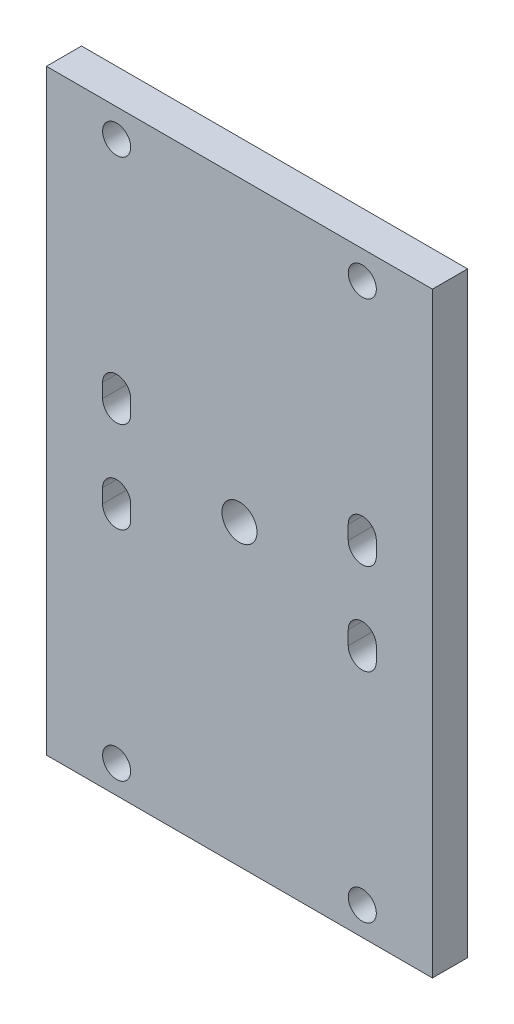
ISO-10303-21;
HEADER;
FILE_DESCRIPTION(('STEP AP214'),'2;1');
FILE_NAME('part.step','',(''),(''),'','','');
FILE_SCHEMA(('AUTOMOTIVE_DESIGN { 1 0 10303 214 1 1 1 1 }'));
ENDSEC;
DATA;
#1=APPLICATION_CONTEXT('core data for automotive mechanical design processes');
#2=APPLICATION_PROTOCOL_DEFINITION('international standard','automotive_design',2000,#1);
#3=PRODUCT_CONTEXT('',#1,'mechanical');
#4=PRODUCT('Part','Part','',(#3));
#5=PRODUCT_RELATED_PRODUCT_CATEGORY('part','',(#4));
#6=PRODUCT_DEFINITION_FORMATION('','',#4);
#7=PRODUCT_DEFINITION_CONTEXT('part definition',#1,'design');
#8=PRODUCT_DEFINITION('design','',#6,#7);
#9=PRODUCT_DEFINITION_SHAPE('','',#8);
#10=(LENGTH_UNIT() NAMED_UNIT(*) SI_UNIT(.MILLI.,.METRE.));
#11=(NAMED_UNIT(*) PLANE_ANGLE_UNIT() SI_UNIT($,.RADIAN.));
#12=(NAMED_UNIT(*) SI_UNIT($,.STERADIAN.) SOLID_ANGLE_UNIT());
#13=UNCERTAINTY_MEASURE_WITH_UNIT(LENGTH_MEASURE(1.E-05),#10,'distance_accuracy_value','');
#14=(GEOMETRIC_REPRESENTATION_CONTEXT(3) GLOBAL_UNCERTAINTY_ASSIGNED_CONTEXT((#13)) GLOBAL_UNIT_ASSIGNED_CONTEXT((#10,
#11,#12)) REPRESENTATION_CONTEXT('',''));
#15=CARTESIAN_POINT('',(0.,0.,0.));
#16=DIRECTION('',(0.,0.,1.));
#17=DIRECTION('',(1.,0.,0.));
#18=AXIS2_PLACEMENT_3D('',#15,#16,#17);
#19=CARTESIAN_POINT('',(17.5,-7.5,-5.));
#20=DIRECTION('',(0.,0.,1.));
#21=DIRECTION('',(1.,0.,0.));
#22=AXIS2_PLACEMENT_3D('',#19,#20,#21);
#23=CYLINDRICAL_SURFACE('',#22,2.);
#24=DIRECTION('',(0.,0.,1.));
#25=VECTOR('',#24,1.);
#26=CARTESIAN_POINT('',(15.5,-7.5,-5.));
#27=LINE('',#26,#25);
#28=CARTESIAN_POINT('',(15.5,-7.5,5.));
#29=VERTEX_POINT('',#28);
#30=CARTESIAN_POINT('',(15.5,-7.5,0.));
#31=VERTEX_POINT('',#30);
#32=EDGE_CURVE('E356',#29,#31,#27,.F.);
#33=ORIENTED_EDGE('',*,*,#32,.F.);
#34=CARTESIAN_POINT('',(17.5,-7.5,5.));
#35=DIRECTION('',(0.,0.,1.));
#36=DIRECTION('',(1.,0.,0.));
#37=AXIS2_PLACEMENT_3D('',#34,#35,#36);
#38=CIRCLE('',#37,2.);
#39=CARTESIAN_POINT('',(19.5,-7.5,5.));
#40=VERTEX_POINT('',#39);
#41=EDGE_CURVE('E270',#29,#40,#38,.T.);
#42=ORIENTED_EDGE('',*,*,#41,.T.);
#43=DIRECTION('',(0.,0.,1.));
#44=VECTOR('',#43,1.);
#45=CARTESIAN_POINT('',(19.5,-7.5,-5.));
#46=LINE('',#45,#44);
#47=CARTESIAN_POINT('',(19.5,-7.5,0.));
#48=VERTEX_POINT('',#47);
#49=EDGE_CURVE('E354',#40,#48,#46,.F.);
#50=ORIENTED_EDGE('',*,*,#49,.T.);
#51=CARTESIAN_POINT('',(17.5,-7.5,0.));
#52=DIRECTION('',(0.,0.,-1.));
#53=DIRECTION('',(-1.,0.,0.));
#54=AXIS2_PLACEMENT_3D('',#51,#52,#53);
#55=CIRCLE('',#54,2.);
#56=EDGE_CURVE('E334',#48,#31,#55,.T.);
#57=ORIENTED_EDGE('',*,*,#56,.T.);
#58=EDGE_LOOP('',(#33,#42,#50,#57));
#59=FACE_BOUND('',#58,.T.);
#60=ADVANCED_FACE('F34',(#59),#23,.F.);
#61=CARTESIAN_POINT('',(-17.5,7.5,-5.));
#62=DIRECTION('',(0.,0.,1.));
#63=DIRECTION('',(1.,0.,0.));
#64=AXIS2_PLACEMENT_3D('',#61,#62,#63);
#65=CYLINDRICAL_SURFACE('',#64,2.);
#66=DIRECTION('',(0.,0.,1.));
#67=VECTOR('',#66,1.);
#68=CARTESIAN_POINT('',(-15.5,7.5,-5.));
#69=LINE('',#68,#67);
#70=CARTESIAN_POINT('',(-15.5,7.5,5.));
#71=VERTEX_POINT('',#70);
#72=CARTESIAN_POINT('',(-15.5,7.5,0.));
#73=VERTEX_POINT('',#72);
#74=EDGE_CURVE('E352',#71,#73,#69,.F.);
#75=ORIENTED_EDGE('',*,*,#74,.F.);
#76=CARTESIAN_POINT('',(-17.5,7.5,5.));
#77=DIRECTION('',(0.,0.,1.));
#78=DIRECTION('',(1.,0.,0.));
#79=AXIS2_PLACEMENT_3D('',#76,#77,#78);
#80=CIRCLE('',#79,2.);
#81=CARTESIAN_POINT('',(-19.5,7.5,5.));
#82=VERTEX_POINT('',#81);
#83=EDGE_CURVE('E285',#71,#82,#80,.T.);
#84=ORIENTED_EDGE('',*,*,#83,.T.);
#85=DIRECTION('',(0.,0.,1.));
#86=VECTOR('',#85,1.);
#87=CARTESIAN_POINT('',(-19.5,7.5,-5.));
#88=LINE('',#87,#86);
#89=CARTESIAN_POINT('',(-19.5,7.5,0.));
#90=VERTEX_POINT('',#89);
#91=EDGE_CURVE('E350',#82,#90,#88,.F.);
#92=ORIENTED_EDGE('',*,*,#91,.T.);
#93=CARTESIAN_POINT('',(-17.5,7.5,0.));
#94=DIRECTION('',(0.,0.,-1.));
#95=DIRECTION('',(-1.,0.,0.));
#96=AXIS2_PLACEMENT_3D('',#93,#94,#95);
#97=CIRCLE('',#96,2.);
#98=EDGE_CURVE('E198',#90,#73,#97,.T.);
#99=ORIENTED_EDGE('',*,*,#98,.T.);
#100=EDGE_LOOP('',(#75,#84,#92,#99));
#101=FACE_BOUND('',#100,.T.);
#102=ADVANCED_FACE('F387',(#101),#65,.F.);
#103=CARTESIAN_POINT('',(27.5,-42.5,5.));
#104=DIRECTION('',(-1.,0.,0.));
#105=DIRECTION('',(0.,0.,1.));
#106=AXIS2_PLACEMENT_3D('',#103,#104,#105);
#107=PLANE('',#106);
#108=DIRECTION('',(0.,1.,0.));
#109=VECTOR('',#108,1.);
#110=CARTESIAN_POINT('',(27.5,-42.5,0.));
#111=LINE('',#110,#109);
#112=CARTESIAN_POINT('',(27.5,-42.5,0.));
#113=VERTEX_POINT('',#112);
#114=CARTESIAN_POINT('',(27.5,42.5,0.));
#115=VERTEX_POINT('',#114);
#116=EDGE_CURVE('E305',#113,#115,#111,.T.);
#117=ORIENTED_EDGE('',*,*,#116,.T.);
#118=DIRECTION('',(0.,0.,-1.));
#119=VECTOR('',#118,1.);
#120=CARTESIAN_POINT('',(27.5,42.5,5.));
#121=LINE('',#120,#119);
#122=CARTESIAN_POINT('',(27.5,42.5,5.));
#123=VERTEX_POINT('',#122);
#124=EDGE_CURVE('E322',#123,#115,#121,.T.);
#125=ORIENTED_EDGE('',*,*,#124,.F.);
#126=DIRECTION('',(0.,1.,0.));
#127=VECTOR('',#126,1.);
#128=CARTESIAN_POINT('',(27.5,-42.5,5.));
#129=LINE('',#128,#127);
#130=CARTESIAN_POINT('',(27.5,-42.5,5.));
#131=VERTEX_POINT('',#130);
#132=EDGE_CURVE('E294',#131,#123,#129,.T.);
#133=ORIENTED_EDGE('',*,*,#132,.F.);
#134=DIRECTION('',(0.,0.,-1.));
#135=VECTOR('',#134,1.);
#136=CARTESIAN_POINT('',(27.5,-42.5,5.));
#137=LINE('',#136,#135);
#138=EDGE_CURVE('E304',#131,#113,#137,.T.);
#139=ORIENTED_EDGE('',*,*,#138,.T.);
#140=EDGE_LOOP('',(#117,#125,#133,#139));
#141=FACE_BOUND('',#140,.T.);
#142=ADVANCED_FACE('F36',(#141),#107,.F.);
#143=CARTESIAN_POINT('',(-27.5,42.5,5.));
#144=DIRECTION('',(0.,-1.,0.));
#145=DIRECTION('',(0.,0.,-1.));
#146=AXIS2_PLACEMENT_3D('',#143,#144,#145);
#147=PLANE('',#146);
#148=DIRECTION('',(-1.,0.,0.));
#149=VECTOR('',#148,1.);
#150=CARTESIAN_POINT('',(-27.5,42.5,0.));
#151=LINE('',#150,#149);
#152=CARTESIAN_POINT('',(-27.5,42.5,0.));
#153=VERTEX_POINT('',#152);
#154=EDGE_CURVE('E308',#115,#153,#151,.T.);
#155=ORIENTED_EDGE('',*,*,#154,.T.);
#156=DIRECTION('',(0.,0.,-1.));
#157=VECTOR('',#156,1.);
#158=CARTESIAN_POINT('',(-27.5,42.5,5.));
#159=LINE('',#158,#157);
#160=CARTESIAN_POINT('',(-27.5,42.5,5.));
#161=VERTEX_POINT('',#160);
#162=EDGE_CURVE('E319',#161,#153,#159,.T.);
#163=ORIENTED_EDGE('',*,*,#162,.F.);
#164=DIRECTION('',(-1.,0.,0.));
#165=VECTOR('',#164,1.);
#166=CARTESIAN_POINT('',(-27.5,42.5,5.));
#167=LINE('',#166,#165);
#168=EDGE_CURVE('E297',#123,#161,#167,.T.);
#169=ORIENTED_EDGE('',*,*,#168,.F.);
#170=ORIENTED_EDGE('',*,*,#124,.T.);
#171=EDGE_LOOP('',(#155,#163,#169,#170));
#172=FACE_BOUND('',#171,.T.);
#173=ADVANCED_FACE('F436',(#172),#147,.F.);
#174=CARTESIAN_POINT('',(-27.5,-42.5,5.));
#175=DIRECTION('',(1.,0.,0.));
#176=DIRECTION('',(0.,0.,-1.));
#177=AXIS2_PLACEMENT_3D('',#174,#175,#176);
#178=PLANE('',#177);
#179=DIRECTION('',(0.,-1.,0.));
#180=VECTOR('',#179,1.);
#181=CARTESIAN_POINT('',(-27.5,-42.5,0.));
#182=LINE('',#181,#180);
#183=CARTESIAN_POINT('',(-27.5,-42.5,0.));
#184=VERTEX_POINT('',#183);
#185=EDGE_CURVE('E311',#153,#184,#182,.T.);
#186=ORIENTED_EDGE('',*,*,#185,.T.);
#187=DIRECTION('',(0.,0.,-1.));
#188=VECTOR('',#187,1.);
#189=CARTESIAN_POINT('',(-27.5,-42.5,5.));
#190=LINE('',#189,#188);
#191=CARTESIAN_POINT('',(-27.5,-42.5,5.));
#192=VERTEX_POINT('',#191);
#193=EDGE_CURVE('E316',#192,#184,#190,.T.);
#194=ORIENTED_EDGE('',*,*,#193,.F.);
#195=DIRECTION('',(0.,-1.,0.));
#196=VECTOR('',#195,1.);
#197=CARTESIAN_POINT('',(-27.5,-42.5,5.));
#198=LINE('',#197,#196);
#199=EDGE_CURVE('E300',#161,#192,#198,.T.);
#200=ORIENTED_EDGE('',*,*,#199,.F.);
#201=ORIENTED_EDGE('',*,*,#162,.T.);
#202=EDGE_LOOP('',(#186,#194,#200,#201));
#203=FACE_BOUND('',#202,.T.);
#204=ADVANCED_FACE('F433',(#203),#178,.F.);
#205=CARTESIAN_POINT('',(-27.5,-42.5,5.));
#206=DIRECTION('',(0.,1.,0.));
#207=DIRECTION('',(0.,0.,1.));
#208=AXIS2_PLACEMENT_3D('',#205,#206,#207);
#209=PLANE('',#208);
#210=DIRECTION('',(1.,0.,0.));
#211=VECTOR('',#210,1.);
#212=CARTESIAN_POINT('',(-27.5,-42.5,0.));
#213=LINE('',#212,#211);
#214=EDGE_CURVE('E298',#184,#113,#213,.T.);
#215=ORIENTED_EDGE('',*,*,#214,.T.);
#216=ORIENTED_EDGE('',*,*,#138,.F.);
#217=DIRECTION('',(1.,0.,0.));
#218=VECTOR('',#217,1.);
#219=CARTESIAN_POINT('',(-27.5,-42.5,5.));
#220=LINE('',#219,#218);
#221=EDGE_CURVE('E302',#192,#131,#220,.T.);
#222=ORIENTED_EDGE('',*,*,#221,.F.);
#223=ORIENTED_EDGE('',*,*,#193,.T.);
#224=EDGE_LOOP('',(#215,#216,#222,#223));
#225=FACE_BOUND('',#224,.T.);
#226=ADVANCED_FACE('F426',(#225),#209,.F.);
#227=CARTESIAN_POINT('',(0.,0.,5.));
#228=DIRECTION('',(0.,0.,-1.));
#229=DIRECTION('',(-1.,0.,0.));
#230=AXIS2_PLACEMENT_3D('',#227,#228,#229);
#231=PLANE('',#230);
#232=CARTESIAN_POINT('',(0.,0.,5.));
#233=DIRECTION('',(0.,0.,1.));
#234=DIRECTION('',(1.,0.,0.));
#235=AXIS2_PLACEMENT_3D('',#232,#233,#234);
#236=CIRCLE('',#235,2.5);
#237=CARTESIAN_POINT('',(2.5,0.,5.));
#238=VERTEX_POINT('',#237);
#239=EDGE_CURVE('E615',#238,#238,#236,.T.);
#240=ORIENTED_EDGE('',*,*,#239,.F.);
#241=EDGE_LOOP('',(#240));
#242=FACE_BOUND('',#241,.T.);
#243=CARTESIAN_POINT('',(17.5,-38.5,5.));
#244=DIRECTION('',(0.,0.,1.));
#245=DIRECTION('',(1.,0.,0.));
#246=AXIS2_PLACEMENT_3D('',#243,#244,#245);
#247=CIRCLE('',#246,2.);
#248=CARTESIAN_POINT('',(19.5,-38.5,5.));
#249=VERTEX_POINT('',#248);
#250=EDGE_CURVE('E273',#249,#249,#247,.T.);
#251=ORIENTED_EDGE('',*,*,#250,.F.);
#252=EDGE_LOOP('',(#251));
#253=FACE_BOUND('',#252,.T.);
#254=CARTESIAN_POINT('',(17.5,38.5,5.));
#255=DIRECTION('',(0.,0.,1.));
#256=DIRECTION('',(-1.,0.,0.));
#257=AXIS2_PLACEMENT_3D('',#254,#255,#256);
#258=CIRCLE('',#257,2.);
#259=CARTESIAN_POINT('',(15.5,38.5,5.));
#260=VERTEX_POINT('',#259);
#261=EDGE_CURVE('E279',#260,#260,#258,.T.);
#262=ORIENTED_EDGE('',*,*,#261,.F.);
#263=EDGE_LOOP('',(#262));
#264=FACE_BOUND('',#263,.T.);
#265=CARTESIAN_POINT('',(17.5,5.5,5.));
#266=DIRECTION('',(0.,0.,-1.));
#267=DIRECTION('',(-1.,0.,0.));
#268=AXIS2_PLACEMENT_3D('',#265,#266,#267);
#269=CIRCLE('',#268,2.);
#270=CARTESIAN_POINT('',(19.5,5.5,5.));
#271=VERTEX_POINT('',#270);
#272=CARTESIAN_POINT('',(15.5,5.5,5.));
#273=VERTEX_POINT('',#272);
#274=EDGE_CURVE('E258',#271,#273,#269,.T.);
#275=ORIENTED_EDGE('',*,*,#274,.T.);
#276=DIRECTION('',(0.,1.,0.));
#277=VECTOR('',#276,1.);
#278=CARTESIAN_POINT('',(15.5,0.,5.));
#279=LINE('',#278,#277);
#280=CARTESIAN_POINT('',(15.5,7.5,5.));
#281=VERTEX_POINT('',#280);
#282=EDGE_CURVE('E241',#273,#281,#279,.T.);
#283=ORIENTED_EDGE('',*,*,#282,.T.);
#284=CARTESIAN_POINT('',(17.5,7.5,5.));
#285=DIRECTION('',(0.,0.,1.));
#286=DIRECTION('',(-1.,0.,0.));
#287=AXIS2_PLACEMENT_3D('',#284,#285,#286);
#288=CIRCLE('',#287,2.);
#289=CARTESIAN_POINT('',(19.5,7.5,5.));
#290=VERTEX_POINT('',#289);
#291=EDGE_CURVE('E282',#290,#281,#288,.T.);
#292=ORIENTED_EDGE('',*,*,#291,.F.);
#293=DIRECTION('',(0.,-1.,0.));
#294=VECTOR('',#293,1.);
#295=CARTESIAN_POINT('',(19.5,0.,5.));
#296=LINE('',#295,#294);
#297=EDGE_CURVE('E237',#290,#271,#296,.T.);
#298=ORIENTED_EDGE('',*,*,#297,.T.);
#299=EDGE_LOOP('',(#275,#283,#292,#298));
#300=FACE_BOUND('',#299,.T.);
#301=ORIENTED_EDGE('',*,*,#83,.F.);
#302=DIRECTION('',(0.,-1.,0.));
#303=VECTOR('',#302,1.);
#304=CARTESIAN_POINT('',(-15.5,0.,5.));
#305=LINE('',#304,#303);
#306=CARTESIAN_POINT('',(-15.5,5.5,5.));
#307=VERTEX_POINT('',#306);
#308=EDGE_CURVE('E245',#71,#307,#305,.T.);
#309=ORIENTED_EDGE('',*,*,#308,.T.);
#310=CARTESIAN_POINT('',(-17.5,5.5,5.));
#311=DIRECTION('',(0.,0.,-1.));
#312=DIRECTION('',(-1.,0.,0.));
#313=AXIS2_PLACEMENT_3D('',#310,#311,#312);
#314=CIRCLE('',#313,2.);
#315=CARTESIAN_POINT('',(-19.5,5.5,5.));
#316=VERTEX_POINT('',#315);
#317=EDGE_CURVE('E261',#307,#316,#314,.T.);
#318=ORIENTED_EDGE('',*,*,#317,.T.);
#319=DIRECTION('',(0.,1.,0.));
#320=VECTOR('',#319,1.);
#321=CARTESIAN_POINT('',(-19.5,0.,5.));
#322=LINE('',#321,#320);
#323=EDGE_CURVE('E179',#316,#82,#322,.T.);
#324=ORIENTED_EDGE('',*,*,#323,.T.);
#325=EDGE_LOOP('',(#301,#309,#318,#324));
#326=FACE_BOUND('',#325,.T.);
#327=ORIENTED_EDGE('',*,*,#41,.F.);
#328=DIRECTION('',(0.,1.,0.));
#329=VECTOR('',#328,1.);
#330=CARTESIAN_POINT('',(15.5,0.,5.));
#331=LINE('',#330,#329);
#332=CARTESIAN_POINT('',(15.5,-5.5,5.));
#333=VERTEX_POINT('',#332);
#334=EDGE_CURVE('E251',#29,#333,#331,.T.);
#335=ORIENTED_EDGE('',*,*,#334,.T.);
#336=CARTESIAN_POINT('',(17.5,-5.5,5.));
#337=DIRECTION('',(0.,0.,-1.));
#338=DIRECTION('',(-1.,0.,0.));
#339=AXIS2_PLACEMENT_3D('',#336,#337,#338);
#340=CIRCLE('',#339,2.);
#341=CARTESIAN_POINT('',(19.5,-5.5,5.));
#342=VERTEX_POINT('',#341);
#343=EDGE_CURVE('E266',#333,#342,#340,.T.);
#344=ORIENTED_EDGE('',*,*,#343,.T.);
#345=DIRECTION('',(0.,-1.,0.));
#346=VECTOR('',#345,1.);
#347=CARTESIAN_POINT('',(19.5,0.,5.));
#348=LINE('',#347,#346);
#349=EDGE_CURVE('E248',#342,#40,#348,.T.);
#350=ORIENTED_EDGE('',*,*,#349,.T.);
#351=EDGE_LOOP('',(#327,#335,#344,#350));
#352=FACE_BOUND('',#351,.T.);
#353=CARTESIAN_POINT('',(-17.5,-5.5,5.));
#354=DIRECTION('',(0.,0.,-1.));
#355=DIRECTION('',(-1.,0.,0.));
#356=AXIS2_PLACEMENT_3D('',#353,#354,#355);
#357=CIRCLE('',#356,2.);
#358=CARTESIAN_POINT('',(-19.5,-5.5,5.));
#359=VERTEX_POINT('',#358);
#360=CARTESIAN_POINT('',(-15.5,-5.5,5.));
#361=VERTEX_POINT('',#360);
#362=EDGE_CURVE('E263',#359,#361,#357,.T.);
#363=ORIENTED_EDGE('',*,*,#362,.T.);
#364=DIRECTION('',(0.,-1.,0.));
#365=VECTOR('',#364,1.);
#366=CARTESIAN_POINT('',(-15.5,0.,5.));
#367=LINE('',#366,#365);
#368=CARTESIAN_POINT('',(-15.5,-7.5,5.));
#369=VERTEX_POINT('',#368);
#370=EDGE_CURVE('E255',#361,#369,#367,.T.);
#371=ORIENTED_EDGE('',*,*,#370,.T.);
#372=CARTESIAN_POINT('',(-17.5,-7.5,5.));
#373=DIRECTION('',(0.,0.,1.));
#374=DIRECTION('',(-1.,0.,0.));
#375=AXIS2_PLACEMENT_3D('',#372,#373,#374);
#376=CIRCLE('',#375,2.);
#377=CARTESIAN_POINT('',(-19.5,-7.5,5.));
#378=VERTEX_POINT('',#377);
#379=EDGE_CURVE('E274',#378,#369,#376,.T.);
#380=ORIENTED_EDGE('',*,*,#379,.F.);
#381=DIRECTION('',(0.,1.,0.));
#382=VECTOR('',#381,1.);
#383=CARTESIAN_POINT('',(-19.5,0.,5.));
#384=LINE('',#383,#382);
#385=EDGE_CURVE('E50',#378,#359,#384,.T.);
#386=ORIENTED_EDGE('',*,*,#385,.T.);
#387=EDGE_LOOP('',(#363,#371,#380,#386));
#388=FACE_BOUND('',#387,.T.);
#389=CARTESIAN_POINT('',(-17.5,-38.5,5.));
#390=DIRECTION('',(0.,0.,1.));
#391=DIRECTION('',(-1.,0.,0.));
#392=AXIS2_PLACEMENT_3D('',#389,#390,#391);
#393=CIRCLE('',#392,2.);
#394=CARTESIAN_POINT('',(-19.5,-38.5,5.));
#395=VERTEX_POINT('',#394);
#396=EDGE_CURVE('E269',#395,#395,#393,.T.);
#397=ORIENTED_EDGE('',*,*,#396,.F.);
#398=EDGE_LOOP('',(#397));
#399=FACE_BOUND('',#398,.T.);
#400=CARTESIAN_POINT('',(-17.5,38.5,5.));
#401=DIRECTION('',(0.,0.,1.));
#402=DIRECTION('',(1.,0.,0.));
#403=AXIS2_PLACEMENT_3D('',#400,#401,#402);
#404=CIRCLE('',#403,2.);
#405=CARTESIAN_POINT('',(-15.5,38.5,5.));
#406=VERTEX_POINT('',#405);
#407=EDGE_CURVE('E288',#406,#406,#404,.T.);
#408=ORIENTED_EDGE('',*,*,#407,.F.);
#409=EDGE_LOOP('',(#408));
#410=FACE_BOUND('',#409,.T.);
#411=ORIENTED_EDGE('',*,*,#132,.T.);
#412=ORIENTED_EDGE('',*,*,#168,.T.);
#413=ORIENTED_EDGE('',*,*,#199,.T.);
#414=ORIENTED_EDGE('',*,*,#221,.T.);
#415=EDGE_LOOP('',(#411,#412,#413,#414));
#416=FACE_BOUND('',#415,.T.);
#417=ADVANCED_FACE('F371',(#242,#253,#264,#300,#326,#352,#388,#399,#410,#416),#231,.F.);
#418=CARTESIAN_POINT('',(0.,0.,0.));
#419=DIRECTION('',(0.,0.,-1.));
#420=DIRECTION('',(-1.,0.,0.));
#421=AXIS2_PLACEMENT_3D('',#418,#419,#420);
#422=PLANE('',#421);
#423=CARTESIAN_POINT('',(0.,0.,0.));
#424=DIRECTION('',(0.,0.,-1.));
#425=DIRECTION('',(-1.,0.,0.));
#426=AXIS2_PLACEMENT_3D('',#423,#424,#425);
#427=CIRCLE('',#426,2.5);
#428=CARTESIAN_POINT('',(-2.5,0.,0.));
#429=VERTEX_POINT('',#428);
#430=EDGE_CURVE('E38',#429,#429,#427,.T.);
#431=ORIENTED_EDGE('',*,*,#430,.F.);
#432=EDGE_LOOP('',(#431));
#433=FACE_BOUND('',#432,.T.);
#434=DIRECTION('',(0.,1.,0.));
#435=VECTOR('',#434,1.);
#436=CARTESIAN_POINT('',(15.5,-7.5,0.));
#437=LINE('',#436,#435);
#438=CARTESIAN_POINT('',(15.5,-5.5,0.));
#439=VERTEX_POINT('',#438);
#440=EDGE_CURVE('E221',#31,#439,#437,.T.);
#441=ORIENTED_EDGE('',*,*,#440,.F.);
#442=ORIENTED_EDGE('',*,*,#56,.F.);
#443=DIRECTION('',(0.,-1.,0.));
#444=VECTOR('',#443,1.);
#445=CARTESIAN_POINT('',(19.5,-7.5,0.));
#446=LINE('',#445,#444);
#447=CARTESIAN_POINT('',(19.5,-5.5,0.));
#448=VERTEX_POINT('',#447);
#449=EDGE_CURVE('E58',#448,#48,#446,.T.);
#450=ORIENTED_EDGE('',*,*,#449,.F.);
#451=CARTESIAN_POINT('',(17.5,-5.5,0.));
#452=DIRECTION('',(0.,0.,-1.));
#453=DIRECTION('',(1.,0.,0.));
#454=AXIS2_PLACEMENT_3D('',#451,#452,#453);
#455=CIRCLE('',#454,2.);
#456=EDGE_CURVE('E217',#439,#448,#455,.T.);
#457=ORIENTED_EDGE('',*,*,#456,.F.);
#458=EDGE_LOOP('',(#441,#442,#450,#457));
#459=FACE_BOUND('',#458,.T.);
#460=DIRECTION('',(0.,-1.,0.));
#461=VECTOR('',#460,1.);
#462=CARTESIAN_POINT('',(-15.5,-7.5,0.));
#463=LINE('',#462,#461);
#464=CARTESIAN_POINT('',(-15.5,-5.5,0.));
#465=VERTEX_POINT('',#464);
#466=CARTESIAN_POINT('',(-15.5,-7.5,0.));
#467=VERTEX_POINT('',#466);
#468=EDGE_CURVE('E212',#465,#467,#463,.T.);
#469=ORIENTED_EDGE('',*,*,#468,.F.);
#470=CARTESIAN_POINT('',(-17.5,-5.5,0.));
#471=DIRECTION('',(0.,0.,-1.));
#472=DIRECTION('',(-1.,0.,0.));
#473=AXIS2_PLACEMENT_3D('',#470,#471,#472);
#474=CIRCLE('',#473,2.);
#475=CARTESIAN_POINT('',(-19.5,-5.5,0.));
#476=VERTEX_POINT('',#475);
#477=EDGE_CURVE('E208',#476,#465,#474,.T.);
#478=ORIENTED_EDGE('',*,*,#477,.F.);
#479=DIRECTION('',(0.,1.,0.));
#480=VECTOR('',#479,1.);
#481=CARTESIAN_POINT('',(-19.5,-7.5,0.));
#482=LINE('',#481,#480);
#483=CARTESIAN_POINT('',(-19.5,-7.5,0.));
#484=VERTEX_POINT('',#483);
#485=EDGE_CURVE('E205',#484,#476,#482,.T.);
#486=ORIENTED_EDGE('',*,*,#485,.F.);
#487=CARTESIAN_POINT('',(-17.5,-7.5,0.));
#488=DIRECTION('',(0.,0.,-1.));
#489=DIRECTION('',(-1.,0.,0.));
#490=AXIS2_PLACEMENT_3D('',#487,#488,#489);
#491=CIRCLE('',#490,2.);
#492=EDGE_CURVE('E331',#467,#484,#491,.T.);
#493=ORIENTED_EDGE('',*,*,#492,.F.);
#494=EDGE_LOOP('',(#469,#478,#486,#493));
#495=FACE_BOUND('',#494,.T.);
#496=DIRECTION('',(0.,-1.,0.));
#497=VECTOR('',#496,1.);
#498=CARTESIAN_POINT('',(-15.5,7.5,0.));
#499=LINE('',#498,#497);
#500=CARTESIAN_POINT('',(-15.5,5.5,0.));
#501=VERTEX_POINT('',#500);
#502=EDGE_CURVE('E183',#73,#501,#499,.T.);
#503=ORIENTED_EDGE('',*,*,#502,.F.);
#504=ORIENTED_EDGE('',*,*,#98,.F.);
#505=DIRECTION('',(0.,1.,0.));
#506=VECTOR('',#505,1.);
#507=CARTESIAN_POINT('',(-19.5,7.5,0.));
#508=LINE('',#507,#506);
#509=CARTESIAN_POINT('',(-19.5,5.5,0.));
#510=VERTEX_POINT('',#509);
#511=EDGE_CURVE('E176',#510,#90,#508,.T.);
#512=ORIENTED_EDGE('',*,*,#511,.F.);
#513=CARTESIAN_POINT('',(-17.5,5.5,0.));
#514=DIRECTION('',(0.,0.,-1.));
#515=DIRECTION('',(1.,0.,0.));
#516=AXIS2_PLACEMENT_3D('',#513,#514,#515);
#517=CIRCLE('',#516,2.);
#518=EDGE_CURVE('E186',#501,#510,#517,.T.);
#519=ORIENTED_EDGE('',*,*,#518,.F.);
#520=EDGE_LOOP('',(#503,#504,#512,#519));
#521=FACE_BOUND('',#520,.T.);
#522=DIRECTION('',(0.,1.,0.));
#523=VECTOR('',#522,1.);
#524=CARTESIAN_POINT('',(15.5,7.5,0.));
#525=LINE('',#524,#523);
#526=CARTESIAN_POINT('',(15.5,5.5,0.));
#527=VERTEX_POINT('',#526);
#528=CARTESIAN_POINT('',(15.5,7.5,0.));
#529=VERTEX_POINT('',#528);
#530=EDGE_CURVE('E232',#527,#529,#525,.T.);
#531=ORIENTED_EDGE('',*,*,#530,.F.);
#532=CARTESIAN_POINT('',(17.5,5.5,0.));
#533=DIRECTION('',(0.,0.,-1.));
#534=DIRECTION('',(-1.,0.,0.));
#535=AXIS2_PLACEMENT_3D('',#532,#533,#534);
#536=CIRCLE('',#535,2.);
#537=CARTESIAN_POINT('',(19.5,5.5,0.));
#538=VERTEX_POINT('',#537);
#539=EDGE_CURVE('E229',#538,#527,#536,.T.);
#540=ORIENTED_EDGE('',*,*,#539,.F.);
#541=DIRECTION('',(0.,-1.,0.));
#542=VECTOR('',#541,1.);
#543=CARTESIAN_POINT('',(19.5,7.5,0.));
#544=LINE('',#543,#542);
#545=CARTESIAN_POINT('',(19.5,7.5,0.));
#546=VERTEX_POINT('',#545);
#547=EDGE_CURVE('E203',#546,#538,#544,.T.);
#548=ORIENTED_EDGE('',*,*,#547,.F.);
#549=CARTESIAN_POINT('',(17.5,7.5,0.));
#550=DIRECTION('',(0.,0.,-1.));
#551=DIRECTION('',(-1.,0.,0.));
#552=AXIS2_PLACEMENT_3D('',#549,#550,#551);
#553=CIRCLE('',#552,2.);
#554=EDGE_CURVE('E338',#529,#546,#553,.T.);
#555=ORIENTED_EDGE('',*,*,#554,.F.);
#556=EDGE_LOOP('',(#531,#540,#548,#555));
#557=FACE_BOUND('',#556,.T.);
#558=CARTESIAN_POINT('',(17.5,-38.5,0.));
#559=DIRECTION('',(0.,0.,-1.));
#560=DIRECTION('',(-1.,0.,0.));
#561=AXIS2_PLACEMENT_3D('',#558,#559,#560);
#562=CIRCLE('',#561,2.);
#563=CARTESIAN_POINT('',(15.5,-38.5,0.));
#564=VERTEX_POINT('',#563);
#565=EDGE_CURVE('E309',#564,#564,#562,.T.);
#566=ORIENTED_EDGE('',*,*,#565,.F.);
#567=EDGE_LOOP('',(#566));
#568=FACE_BOUND('',#567,.T.);
#569=CARTESIAN_POINT('',(17.5,38.5,0.));
#570=DIRECTION('',(0.,0.,-1.));
#571=DIRECTION('',(-1.,0.,0.));
#572=AXIS2_PLACEMENT_3D('',#569,#570,#571);
#573=CIRCLE('',#572,2.);
#574=CARTESIAN_POINT('',(15.5,38.5,0.));
#575=VERTEX_POINT('',#574);
#576=EDGE_CURVE('E341',#575,#575,#573,.T.);
#577=ORIENTED_EDGE('',*,*,#576,.F.);
#578=EDGE_LOOP('',(#577));
#579=FACE_BOUND('',#578,.T.);
#580=CARTESIAN_POINT('',(-17.5,-38.5,0.));
#581=DIRECTION('',(0.,0.,-1.));
#582=DIRECTION('',(-1.,0.,0.));
#583=AXIS2_PLACEMENT_3D('',#580,#581,#582);
#584=CIRCLE('',#583,2.);
#585=CARTESIAN_POINT('',(-19.5,-38.5,0.));
#586=VERTEX_POINT('',#585);
#587=EDGE_CURVE('E328',#586,#586,#584,.T.);
#588=ORIENTED_EDGE('',*,*,#587,.F.);
#589=EDGE_LOOP('',(#588));
#590=FACE_BOUND('',#589,.T.);
#591=CARTESIAN_POINT('',(-17.5,38.5,0.));
#592=DIRECTION('',(0.,0.,-1.));
#593=DIRECTION('',(-1.,0.,0.));
#594=AXIS2_PLACEMENT_3D('',#591,#592,#593);
#595=CIRCLE('',#594,2.);
#596=CARTESIAN_POINT('',(-19.5,38.5,0.));
#597=VERTEX_POINT('',#596);
#598=EDGE_CURVE('E293',#597,#597,#595,.T.);
#599=ORIENTED_EDGE('',*,*,#598,.F.);
#600=EDGE_LOOP('',(#599));
#601=FACE_BOUND('',#600,.T.);
#602=ORIENTED_EDGE('',*,*,#116,.F.);
#603=ORIENTED_EDGE('',*,*,#214,.F.);
#604=ORIENTED_EDGE('',*,*,#185,.F.);
#605=ORIENTED_EDGE('',*,*,#154,.F.);
#606=EDGE_LOOP('',(#602,#603,#604,#605));
#607=FACE_BOUND('',#606,.T.);
#608=ADVANCED_FACE('F195',(#433,#459,#495,#521,#557,#568,#579,#590,#601,#607),#422,.T.);
#609=CARTESIAN_POINT('',(-17.5,38.5,-5.));
#610=DIRECTION('',(0.,0.,1.));
#611=DIRECTION('',(1.,0.,0.));
#612=AXIS2_PLACEMENT_3D('',#609,#610,#611);
#613=CYLINDRICAL_SURFACE('',#612,2.);
#614=ORIENTED_EDGE('',*,*,#598,.T.);
#615=EDGE_LOOP('',(#614));
#616=FACE_BOUND('',#615,.T.);
#617=ORIENTED_EDGE('',*,*,#407,.T.);
#618=EDGE_LOOP('',(#617));
#619=FACE_BOUND('',#618,.T.);
#620=ADVANCED_FACE('F407',(#616,#619),#613,.F.);
#621=CARTESIAN_POINT('',(-17.5,-38.5,-5.));
#622=DIRECTION('',(0.,0.,1.));
#623=DIRECTION('',(1.,0.,0.));
#624=AXIS2_PLACEMENT_3D('',#621,#622,#623);
#625=CYLINDRICAL_SURFACE('',#624,2.);
#626=ORIENTED_EDGE('',*,*,#587,.T.);
#627=EDGE_LOOP('',(#626));
#628=FACE_BOUND('',#627,.T.);
#629=ORIENTED_EDGE('',*,*,#396,.T.);
#630=EDGE_LOOP('',(#629));
#631=FACE_BOUND('',#630,.T.);
#632=ADVANCED_FACE('F404',(#628,#631),#625,.F.);
#633=CARTESIAN_POINT('',(-17.5,-7.5,-5.));
#634=DIRECTION('',(0.,0.,1.));
#635=DIRECTION('',(1.,0.,0.));
#636=AXIS2_PLACEMENT_3D('',#633,#634,#635);
#637=CYLINDRICAL_SURFACE('',#636,2.);
#638=ORIENTED_EDGE('',*,*,#379,.T.);
#639=DIRECTION('',(0.,0.,1.));
#640=VECTOR('',#639,1.);
#641=CARTESIAN_POINT('',(-15.5,-7.5,-5.));
#642=LINE('',#641,#640);
#643=EDGE_CURVE('E11',#369,#467,#642,.F.);
#644=ORIENTED_EDGE('',*,*,#643,.T.);
#645=ORIENTED_EDGE('',*,*,#492,.T.);
#646=DIRECTION('',(0.,0.,1.));
#647=VECTOR('',#646,1.);
#648=CARTESIAN_POINT('',(-19.5,-7.5,-5.));
#649=LINE('',#648,#647);
#650=EDGE_CURVE('E43',#378,#484,#649,.F.);
#651=ORIENTED_EDGE('',*,*,#650,.F.);
#652=EDGE_LOOP('',(#638,#644,#645,#651));
#653=FACE_BOUND('',#652,.T.);
#654=ADVANCED_FACE('F366',(#653),#637,.F.);
#655=CARTESIAN_POINT('',(17.5,7.5,-5.));
#656=DIRECTION('',(0.,0.,1.));
#657=DIRECTION('',(1.,0.,0.));
#658=AXIS2_PLACEMENT_3D('',#655,#656,#657);
#659=CYLINDRICAL_SURFACE('',#658,2.);
#660=ORIENTED_EDGE('',*,*,#291,.T.);
#661=DIRECTION('',(0.,0.,1.));
#662=VECTOR('',#661,1.);
#663=CARTESIAN_POINT('',(15.5,7.5,-5.));
#664=LINE('',#663,#662);
#665=EDGE_CURVE('E347',#281,#529,#664,.F.);
#666=ORIENTED_EDGE('',*,*,#665,.T.);
#667=ORIENTED_EDGE('',*,*,#554,.T.);
#668=DIRECTION('',(0.,0.,1.));
#669=VECTOR('',#668,1.);
#670=CARTESIAN_POINT('',(19.5,7.5,-5.));
#671=LINE('',#670,#669);
#672=EDGE_CURVE('E325',#290,#546,#671,.F.);
#673=ORIENTED_EDGE('',*,*,#672,.F.);
#674=EDGE_LOOP('',(#660,#666,#667,#673));
#675=FACE_BOUND('',#674,.T.);
#676=ADVANCED_FACE('F403',(#675),#659,.F.);
#677=CARTESIAN_POINT('',(17.5,38.5,-5.));
#678=DIRECTION('',(0.,0.,1.));
#679=DIRECTION('',(1.,0.,0.));
#680=AXIS2_PLACEMENT_3D('',#677,#678,#679);
#681=CYLINDRICAL_SURFACE('',#680,2.);
#682=ORIENTED_EDGE('',*,*,#576,.T.);
#683=EDGE_LOOP('',(#682));
#684=FACE_BOUND('',#683,.T.);
#685=ORIENTED_EDGE('',*,*,#261,.T.);
#686=EDGE_LOOP('',(#685));
#687=FACE_BOUND('',#686,.T.);
#688=ADVANCED_FACE('F409',(#684,#687),#681,.F.);
#689=CARTESIAN_POINT('',(17.5,-38.5,-5.));
#690=DIRECTION('',(0.,0.,1.));
#691=DIRECTION('',(1.,0.,0.));
#692=AXIS2_PLACEMENT_3D('',#689,#690,#691);
#693=CYLINDRICAL_SURFACE('',#692,2.);
#694=ORIENTED_EDGE('',*,*,#565,.T.);
#695=EDGE_LOOP('',(#694));
#696=FACE_BOUND('',#695,.T.);
#697=ORIENTED_EDGE('',*,*,#250,.T.);
#698=EDGE_LOOP('',(#697));
#699=FACE_BOUND('',#698,.T.);
#700=ADVANCED_FACE('F412',(#696,#699),#693,.F.);
#701=CARTESIAN_POINT('',(17.5,5.5,10.));
#702=DIRECTION('',(0.,0.,-1.));
#703=DIRECTION('',(-1.,0.,0.));
#704=AXIS2_PLACEMENT_3D('',#701,#702,#703);
#705=CYLINDRICAL_SURFACE('',#704,2.);
#706=DIRECTION('',(0.,0.,-1.));
#707=VECTOR('',#706,1.);
#708=CARTESIAN_POINT('',(19.5,5.5,10.));
#709=LINE('',#708,#707);
#710=EDGE_CURVE('E234',#271,#538,#709,.T.);
#711=ORIENTED_EDGE('',*,*,#710,.T.);
#712=ORIENTED_EDGE('',*,*,#539,.T.);
#713=DIRECTION('',(0.,0.,-1.));
#714=VECTOR('',#713,1.);
#715=CARTESIAN_POINT('',(15.5,5.5,10.));
#716=LINE('',#715,#714);
#717=EDGE_CURVE('E235',#273,#527,#716,.T.);
#718=ORIENTED_EDGE('',*,*,#717,.F.);
#719=ORIENTED_EDGE('',*,*,#274,.F.);
#720=EDGE_LOOP('',(#711,#712,#718,#719));
#721=FACE_BOUND('',#720,.T.);
#722=ADVANCED_FACE('F415',(#721),#705,.F.);
#723=CARTESIAN_POINT('',(15.5,7.5,10.));
#724=DIRECTION('',(-1.,0.,0.));
#725=DIRECTION('',(0.,0.,1.));
#726=AXIS2_PLACEMENT_3D('',#723,#724,#725);
#727=PLANE('',#726);
#728=ORIENTED_EDGE('',*,*,#717,.T.);
#729=ORIENTED_EDGE('',*,*,#530,.T.);
#730=ORIENTED_EDGE('',*,*,#665,.F.);
#731=ORIENTED_EDGE('',*,*,#282,.F.);
#732=EDGE_LOOP('',(#728,#729,#730,#731));
#733=FACE_BOUND('',#732,.T.);
#734=ADVANCED_FACE('F523',(#733),#727,.F.);
#735=CARTESIAN_POINT('',(19.5,7.5,10.));
#736=DIRECTION('',(1.,0.,0.));
#737=DIRECTION('',(0.,0.,-1.));
#738=AXIS2_PLACEMENT_3D('',#735,#736,#737);
#739=PLANE('',#738);
#740=ORIENTED_EDGE('',*,*,#672,.T.);
#741=ORIENTED_EDGE('',*,*,#547,.T.);
#742=ORIENTED_EDGE('',*,*,#710,.F.);
#743=ORIENTED_EDGE('',*,*,#297,.F.);
#744=EDGE_LOOP('',(#740,#741,#742,#743));
#745=FACE_BOUND('',#744,.T.);
#746=ADVANCED_FACE('F399',(#745),#739,.F.);
#747=CARTESIAN_POINT('',(-17.5,5.5,10.));
#748=DIRECTION('',(0.,0.,-1.));
#749=DIRECTION('',(-1.,0.,0.));
#750=AXIS2_PLACEMENT_3D('',#747,#748,#749);
#751=CYLINDRICAL_SURFACE('',#750,2.);
#752=DIRECTION('',(0.,0.,-1.));
#753=VECTOR('',#752,1.);
#754=CARTESIAN_POINT('',(-15.5,5.5,10.));
#755=LINE('',#754,#753);
#756=EDGE_CURVE('E182',#307,#501,#755,.T.);
#757=ORIENTED_EDGE('',*,*,#756,.T.);
#758=ORIENTED_EDGE('',*,*,#518,.T.);
#759=DIRECTION('',(0.,0.,-1.));
#760=VECTOR('',#759,1.);
#761=CARTESIAN_POINT('',(-19.5,5.5,10.));
#762=LINE('',#761,#760);
#763=EDGE_CURVE('E172',#316,#510,#762,.T.);
#764=ORIENTED_EDGE('',*,*,#763,.F.);
#765=ORIENTED_EDGE('',*,*,#317,.F.);
#766=EDGE_LOOP('',(#757,#758,#764,#765));
#767=FACE_BOUND('',#766,.T.);
#768=ADVANCED_FACE('F187',(#767),#751,.F.);
#769=CARTESIAN_POINT('',(-15.5,7.5,10.));
#770=DIRECTION('',(1.,0.,0.));
#771=DIRECTION('',(0.,0.,-1.));
#772=AXIS2_PLACEMENT_3D('',#769,#770,#771);
#773=PLANE('',#772);
#774=ORIENTED_EDGE('',*,*,#74,.T.);
#775=ORIENTED_EDGE('',*,*,#502,.T.);
#776=ORIENTED_EDGE('',*,*,#756,.F.);
#777=ORIENTED_EDGE('',*,*,#308,.F.);
#778=EDGE_LOOP('',(#774,#775,#776,#777));
#779=FACE_BOUND('',#778,.T.);
#780=ADVANCED_FACE('F542',(#779),#773,.F.);
#781=CARTESIAN_POINT('',(-19.5,7.5,10.));
#782=DIRECTION('',(-1.,0.,0.));
#783=DIRECTION('',(0.,0.,1.));
#784=AXIS2_PLACEMENT_3D('',#781,#782,#783);
#785=PLANE('',#784);
#786=ORIENTED_EDGE('',*,*,#763,.T.);
#787=ORIENTED_EDGE('',*,*,#511,.T.);
#788=ORIENTED_EDGE('',*,*,#91,.F.);
#789=ORIENTED_EDGE('',*,*,#323,.F.);
#790=EDGE_LOOP('',(#786,#787,#788,#789));
#791=FACE_BOUND('',#790,.T.);
#792=ADVANCED_FACE('F174',(#791),#785,.F.);
#793=CARTESIAN_POINT('',(17.5,-5.5,10.));
#794=DIRECTION('',(0.,0.,-1.));
#795=DIRECTION('',(-1.,0.,0.));
#796=AXIS2_PLACEMENT_3D('',#793,#794,#795);
#797=CYLINDRICAL_SURFACE('',#796,2.);
#798=DIRECTION('',(0.,0.,-1.));
#799=VECTOR('',#798,1.);
#800=CARTESIAN_POINT('',(15.5,-5.5,10.));
#801=LINE('',#800,#799);
#802=EDGE_CURVE('E209',#333,#439,#801,.T.);
#803=ORIENTED_EDGE('',*,*,#802,.T.);
#804=ORIENTED_EDGE('',*,*,#456,.T.);
#805=DIRECTION('',(0.,0.,-1.));
#806=VECTOR('',#805,1.);
#807=CARTESIAN_POINT('',(19.5,-5.5,10.));
#808=LINE('',#807,#806);
#809=EDGE_CURVE('E224',#342,#448,#808,.T.);
#810=ORIENTED_EDGE('',*,*,#809,.F.);
#811=ORIENTED_EDGE('',*,*,#343,.F.);
#812=EDGE_LOOP('',(#803,#804,#810,#811));
#813=FACE_BOUND('',#812,.T.);
#814=ADVANCED_FACE('F556',(#813),#797,.F.);
#815=CARTESIAN_POINT('',(15.5,-7.5,10.));
#816=DIRECTION('',(-1.,0.,0.));
#817=DIRECTION('',(0.,0.,1.));
#818=AXIS2_PLACEMENT_3D('',#815,#816,#817);
#819=PLANE('',#818);
#820=ORIENTED_EDGE('',*,*,#32,.T.);
#821=ORIENTED_EDGE('',*,*,#440,.T.);
#822=ORIENTED_EDGE('',*,*,#802,.F.);
#823=ORIENTED_EDGE('',*,*,#334,.F.);
#824=EDGE_LOOP('',(#820,#821,#822,#823));
#825=FACE_BOUND('',#824,.T.);
#826=ADVANCED_FACE('F383',(#825),#819,.F.);
#827=CARTESIAN_POINT('',(19.5,-7.5,10.));
#828=DIRECTION('',(1.,0.,0.));
#829=DIRECTION('',(0.,0.,-1.));
#830=AXIS2_PLACEMENT_3D('',#827,#828,#829);
#831=PLANE('',#830);
#832=ORIENTED_EDGE('',*,*,#809,.T.);
#833=ORIENTED_EDGE('',*,*,#449,.T.);
#834=ORIENTED_EDGE('',*,*,#49,.F.);
#835=ORIENTED_EDGE('',*,*,#349,.F.);
#836=EDGE_LOOP('',(#832,#833,#834,#835));
#837=FACE_BOUND('',#836,.T.);
#838=ADVANCED_FACE('F376',(#837),#831,.F.);
#839=CARTESIAN_POINT('',(-17.5,-5.5,10.));
#840=DIRECTION('',(0.,0.,-1.));
#841=DIRECTION('',(-1.,0.,0.));
#842=AXIS2_PLACEMENT_3D('',#839,#840,#841);
#843=CYLINDRICAL_SURFACE('',#842,2.);
#844=DIRECTION('',(0.,0.,-1.));
#845=VECTOR('',#844,1.);
#846=CARTESIAN_POINT('',(-19.5,-5.5,10.));
#847=LINE('',#846,#845);
#848=EDGE_CURVE('E214',#359,#476,#847,.T.);
#849=ORIENTED_EDGE('',*,*,#848,.T.);
#850=ORIENTED_EDGE('',*,*,#477,.T.);
#851=DIRECTION('',(0.,0.,-1.));
#852=VECTOR('',#851,1.);
#853=CARTESIAN_POINT('',(-15.5,-5.5,10.));
#854=LINE('',#853,#852);
#855=EDGE_CURVE('E192',#361,#465,#854,.T.);
#856=ORIENTED_EDGE('',*,*,#855,.F.);
#857=ORIENTED_EDGE('',*,*,#362,.F.);
#858=EDGE_LOOP('',(#849,#850,#856,#857));
#859=FACE_BOUND('',#858,.T.);
#860=ADVANCED_FACE('F374',(#859),#843,.F.);
#861=CARTESIAN_POINT('',(-15.5,-7.5,10.));
#862=DIRECTION('',(1.,0.,0.));
#863=DIRECTION('',(0.,0.,-1.));
#864=AXIS2_PLACEMENT_3D('',#861,#862,#863);
#865=PLANE('',#864);
#866=ORIENTED_EDGE('',*,*,#855,.T.);
#867=ORIENTED_EDGE('',*,*,#468,.T.);
#868=ORIENTED_EDGE('',*,*,#643,.F.);
#869=ORIENTED_EDGE('',*,*,#370,.F.);
#870=EDGE_LOOP('',(#866,#867,#868,#869));
#871=FACE_BOUND('',#870,.T.);
#872=ADVANCED_FACE('F368',(#871),#865,.F.);
#873=CARTESIAN_POINT('',(-19.5,-7.5,10.));
#874=DIRECTION('',(-1.,0.,0.));
#875=DIRECTION('',(0.,0.,1.));
#876=AXIS2_PLACEMENT_3D('',#873,#874,#875);
#877=PLANE('',#876);
#878=ORIENTED_EDGE('',*,*,#650,.T.);
#879=ORIENTED_EDGE('',*,*,#485,.T.);
#880=ORIENTED_EDGE('',*,*,#848,.F.);
#881=ORIENTED_EDGE('',*,*,#385,.F.);
#882=EDGE_LOOP('',(#878,#879,#880,#881));
#883=FACE_BOUND('',#882,.T.);
#884=ADVANCED_FACE('F359',(#883),#877,.F.);
#885=CARTESIAN_POINT('',(0.,0.,-5.));
#886=DIRECTION('',(0.,0.,1.));
#887=DIRECTION('',(1.,0.,0.));
#888=AXIS2_PLACEMENT_3D('',#885,#886,#887);
#889=CYLINDRICAL_SURFACE('',#888,2.5);
#890=ORIENTED_EDGE('',*,*,#430,.T.);
#891=EDGE_LOOP('',(#890));
#892=FACE_BOUND('',#891,.T.);
#893=ORIENTED_EDGE('',*,*,#239,.T.);
#894=EDGE_LOOP('',(#893));
#895=FACE_BOUND('',#894,.T.);
#896=ADVANCED_FACE('F593',(#892,#895),#889,.F.);
#897=CLOSED_SHELL('',(#60,#102,#142,#173,#204,#226,#417,#608,#620,#632,#654,#676,#688,#700,#722,
#734,#746,#768,#780,#792,#814,#826,#838,#860,#872,#884,#896));
#898=MANIFOLD_SOLID_BREP('B2',#897);
#899=ADVANCED_BREP_SHAPE_REPRESENTATION('',(#18,#898),#14);
#900=SHAPE_DEFINITION_REPRESENTATION(#9,#899);
ENDSEC;
END-ISO-10303-21;
